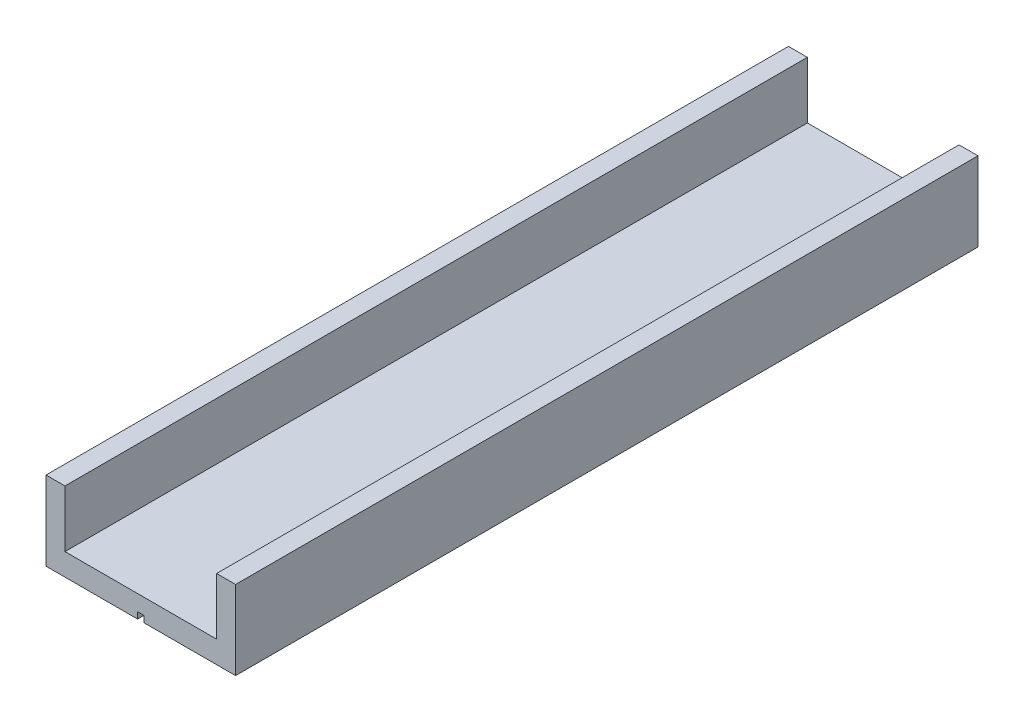
ISO-10303-21;
HEADER;
FILE_DESCRIPTION(('STEP AP214'),'2;1');
FILE_NAME('part.step','',(''),(''),'','','');
FILE_SCHEMA(('AUTOMOTIVE_DESIGN { 1 0 10303 214 1 1 1 1 }'));
ENDSEC;
DATA;
#1=APPLICATION_CONTEXT('core data for automotive mechanical design processes');
#2=APPLICATION_PROTOCOL_DEFINITION('international standard','automotive_design',2000,#1);
#3=PRODUCT_CONTEXT('',#1,'mechanical');
#4=PRODUCT('Part','Part','',(#3));
#5=PRODUCT_RELATED_PRODUCT_CATEGORY('part','',(#4));
#6=PRODUCT_DEFINITION_FORMATION('','',#4);
#7=PRODUCT_DEFINITION_CONTEXT('part definition',#1,'design');
#8=PRODUCT_DEFINITION('design','',#6,#7);
#9=PRODUCT_DEFINITION_SHAPE('','',#8);
#10=(LENGTH_UNIT() NAMED_UNIT(*) SI_UNIT(.MILLI.,.METRE.));
#11=(NAMED_UNIT(*) PLANE_ANGLE_UNIT() SI_UNIT($,.RADIAN.));
#12=(NAMED_UNIT(*) SI_UNIT($,.STERADIAN.) SOLID_ANGLE_UNIT());
#13=UNCERTAINTY_MEASURE_WITH_UNIT(LENGTH_MEASURE(1.E-05),#10,'distance_accuracy_value','');
#14=(GEOMETRIC_REPRESENTATION_CONTEXT(3) GLOBAL_UNCERTAINTY_ASSIGNED_CONTEXT((#13)) GLOBAL_UNIT_ASSIGNED_CONTEXT((#10,
#11,#12)) REPRESENTATION_CONTEXT('',''));
#15=CARTESIAN_POINT('',(0.,0.,0.));
#16=DIRECTION('',(0.,0.,1.));
#17=DIRECTION('',(1.,0.,0.));
#18=AXIS2_PLACEMENT_3D('',#15,#16,#17);
#19=CARTESIAN_POINT('',(0.,0.,235.));
#20=DIRECTION('',(1.,0.,0.));
#21=DIRECTION('',(0.,0.,-1.));
#22=AXIS2_PLACEMENT_3D('',#19,#20,#21);
#23=PLANE('',#22);
#24=DIRECTION('',(0.,-1.,0.));
#25=VECTOR('',#24,1.);
#26=CARTESIAN_POINT('',(0.,0.,0.));
#27=LINE('',#26,#25);
#28=CARTESIAN_POINT('',(0.,25.,0.));
#29=VERTEX_POINT('',#28);
#30=CARTESIAN_POINT('',(0.,0.,0.));
#31=VERTEX_POINT('',#30);
#32=EDGE_CURVE('E155',#29,#31,#27,.T.);
#33=ORIENTED_EDGE('',*,*,#32,.T.);
#34=DIRECTION('',(0.,0.,-1.));
#35=VECTOR('',#34,1.);
#36=CARTESIAN_POINT('',(0.,0.,235.));
#37=LINE('',#36,#35);
#38=CARTESIAN_POINT('',(0.,0.,235.));
#39=VERTEX_POINT('',#38);
#40=EDGE_CURVE('E11',#39,#31,#37,.T.);
#41=ORIENTED_EDGE('',*,*,#40,.F.);
#42=DIRECTION('',(0.,-1.,0.));
#43=VECTOR('',#42,1.);
#44=CARTESIAN_POINT('',(0.,0.,235.));
#45=LINE('',#44,#43);
#46=CARTESIAN_POINT('',(0.,25.,235.));
#47=VERTEX_POINT('',#46);
#48=EDGE_CURVE('E177',#47,#39,#45,.T.);
#49=ORIENTED_EDGE('',*,*,#48,.F.);
#50=DIRECTION('',(0.,0.,-1.));
#51=VECTOR('',#50,1.);
#52=CARTESIAN_POINT('',(0.,25.,235.));
#53=LINE('',#52,#51);
#54=EDGE_CURVE('E151',#47,#29,#53,.T.);
#55=ORIENTED_EDGE('',*,*,#54,.T.);
#56=EDGE_LOOP('',(#33,#41,#49,#55));
#57=FACE_BOUND('',#56,.T.);
#58=ADVANCED_FACE('F35',(#57),#23,.F.);
#59=CARTESIAN_POINT('',(0.,0.,235.));
#60=DIRECTION('',(0.,1.,0.));
#61=DIRECTION('',(0.,0.,1.));
#62=AXIS2_PLACEMENT_3D('',#59,#60,#61);
#63=PLANE('',#62);
#64=DIRECTION('',(1.,0.,0.));
#65=VECTOR('',#64,1.);
#66=CARTESIAN_POINT('',(0.,0.,0.));
#67=LINE('',#66,#65);
#68=CARTESIAN_POINT('',(29.,0.,0.));
#69=VERTEX_POINT('',#68);
#70=EDGE_CURVE('E158',#31,#69,#67,.T.);
#71=ORIENTED_EDGE('',*,*,#70,.T.);
#72=DIRECTION('',(0.,0.,-1.));
#73=VECTOR('',#72,1.);
#74=CARTESIAN_POINT('',(29.,0.,235.));
#75=LINE('',#74,#73);
#76=CARTESIAN_POINT('',(29.,0.,235.));
#77=VERTEX_POINT('',#76);
#78=EDGE_CURVE('E43',#77,#69,#75,.T.);
#79=ORIENTED_EDGE('',*,*,#78,.F.);
#80=DIRECTION('',(1.,0.,0.));
#81=VECTOR('',#80,1.);
#82=CARTESIAN_POINT('',(0.,0.,235.));
#83=LINE('',#82,#81);
#84=EDGE_CURVE('E106',#39,#77,#83,.T.);
#85=ORIENTED_EDGE('',*,*,#84,.F.);
#86=ORIENTED_EDGE('',*,*,#40,.T.);
#87=EDGE_LOOP('',(#71,#79,#85,#86));
#88=FACE_BOUND('',#87,.T.);
#89=ADVANCED_FACE('F255',(#88),#63,.F.);
#90=CARTESIAN_POINT('',(29.,0.,235.));
#91=DIRECTION('',(-1.,0.,0.));
#92=DIRECTION('',(0.,0.,1.));
#93=AXIS2_PLACEMENT_3D('',#90,#91,#92);
#94=PLANE('',#93);
#95=DIRECTION('',(0.,1.,0.));
#96=VECTOR('',#95,1.);
#97=CARTESIAN_POINT('',(29.,0.,0.));
#98=LINE('',#97,#96);
#99=CARTESIAN_POINT('',(29.,2.,0.));
#100=VERTEX_POINT('',#99);
#101=EDGE_CURVE('E160',#69,#100,#98,.T.);
#102=ORIENTED_EDGE('',*,*,#101,.T.);
#103=DIRECTION('',(0.,0.,-1.));
#104=VECTOR('',#103,1.);
#105=CARTESIAN_POINT('',(29.,2.,235.));
#106=LINE('',#105,#104);
#107=CARTESIAN_POINT('',(29.,2.,235.));
#108=VERTEX_POINT('',#107);
#109=EDGE_CURVE('E196',#108,#100,#106,.T.);
#110=ORIENTED_EDGE('',*,*,#109,.F.);
#111=DIRECTION('',(0.,1.,0.));
#112=VECTOR('',#111,1.);
#113=CARTESIAN_POINT('',(29.,0.,235.));
#114=LINE('',#113,#112);
#115=EDGE_CURVE('E204',#77,#108,#114,.T.);
#116=ORIENTED_EDGE('',*,*,#115,.F.);
#117=ORIENTED_EDGE('',*,*,#78,.T.);
#118=EDGE_LOOP('',(#102,#110,#116,#117));
#119=FACE_BOUND('',#118,.T.);
#120=ADVANCED_FACE('F202',(#119),#94,.F.);
#121=CARTESIAN_POINT('',(29.,2.,235.));
#122=DIRECTION('',(0.,1.,0.));
#123=DIRECTION('',(0.,0.,1.));
#124=AXIS2_PLACEMENT_3D('',#121,#122,#123);
#125=PLANE('',#124);
#126=DIRECTION('',(1.,0.,0.));
#127=VECTOR('',#126,1.);
#128=CARTESIAN_POINT('',(29.,2.,0.));
#129=LINE('',#128,#127);
#130=CARTESIAN_POINT('',(31.,2.,0.));
#131=VERTEX_POINT('',#130);
#132=EDGE_CURVE('E162',#100,#131,#129,.T.);
#133=ORIENTED_EDGE('',*,*,#132,.T.);
#134=DIRECTION('',(0.,0.,-1.));
#135=VECTOR('',#134,1.);
#136=CARTESIAN_POINT('',(31.,2.,235.));
#137=LINE('',#136,#135);
#138=CARTESIAN_POINT('',(31.,2.,235.));
#139=VERTEX_POINT('',#138);
#140=EDGE_CURVE('E193',#139,#131,#137,.T.);
#141=ORIENTED_EDGE('',*,*,#140,.F.);
#142=DIRECTION('',(1.,0.,0.));
#143=VECTOR('',#142,1.);
#144=CARTESIAN_POINT('',(29.,2.,235.));
#145=LINE('',#144,#143);
#146=EDGE_CURVE('E222',#108,#139,#145,.T.);
#147=ORIENTED_EDGE('',*,*,#146,.F.);
#148=ORIENTED_EDGE('',*,*,#109,.T.);
#149=EDGE_LOOP('',(#133,#141,#147,#148));
#150=FACE_BOUND('',#149,.T.);
#151=ADVANCED_FACE('F213',(#150),#125,.F.);
#152=CARTESIAN_POINT('',(31.,2.,235.));
#153=DIRECTION('',(1.,0.,0.));
#154=DIRECTION('',(0.,0.,-1.));
#155=AXIS2_PLACEMENT_3D('',#152,#153,#154);
#156=PLANE('',#155);
#157=DIRECTION('',(0.,-1.,0.));
#158=VECTOR('',#157,1.);
#159=CARTESIAN_POINT('',(31.,2.,0.));
#160=LINE('',#159,#158);
#161=CARTESIAN_POINT('',(31.,0.,0.));
#162=VERTEX_POINT('',#161);
#163=EDGE_CURVE('E164',#131,#162,#160,.T.);
#164=ORIENTED_EDGE('',*,*,#163,.T.);
#165=DIRECTION('',(0.,0.,-1.));
#166=VECTOR('',#165,1.);
#167=CARTESIAN_POINT('',(31.,0.,235.));
#168=LINE('',#167,#166);
#169=CARTESIAN_POINT('',(31.,0.,235.));
#170=VERTEX_POINT('',#169);
#171=EDGE_CURVE('E190',#170,#162,#168,.T.);
#172=ORIENTED_EDGE('',*,*,#171,.F.);
#173=DIRECTION('',(0.,-1.,0.));
#174=VECTOR('',#173,1.);
#175=CARTESIAN_POINT('',(31.,2.,235.));
#176=LINE('',#175,#174);
#177=EDGE_CURVE('E219',#139,#170,#176,.T.);
#178=ORIENTED_EDGE('',*,*,#177,.F.);
#179=ORIENTED_EDGE('',*,*,#140,.T.);
#180=EDGE_LOOP('',(#164,#172,#178,#179));
#181=FACE_BOUND('',#180,.T.);
#182=ADVANCED_FACE('F217',(#181),#156,.F.);
#183=CARTESIAN_POINT('',(60.,0.,235.));
#184=DIRECTION('',(0.,1.,0.));
#185=DIRECTION('',(-1.,0.,0.));
#186=AXIS2_PLACEMENT_3D('',#183,#184,#185);
#187=PLANE('',#186);
#188=DIRECTION('',(1.,0.,0.));
#189=VECTOR('',#188,1.);
#190=CARTESIAN_POINT('',(60.,0.,0.));
#191=LINE('',#190,#189);
#192=CARTESIAN_POINT('',(60.,0.,0.));
#193=VERTEX_POINT('',#192);
#194=EDGE_CURVE('E166',#162,#193,#191,.T.);
#195=ORIENTED_EDGE('',*,*,#194,.T.);
#196=DIRECTION('',(0.,0.,-1.));
#197=VECTOR('',#196,1.);
#198=CARTESIAN_POINT('',(60.,0.,235.));
#199=LINE('',#198,#197);
#200=CARTESIAN_POINT('',(60.,0.,235.));
#201=VERTEX_POINT('',#200);
#202=EDGE_CURVE('E187',#201,#193,#199,.T.);
#203=ORIENTED_EDGE('',*,*,#202,.F.);
#204=DIRECTION('',(1.,0.,0.));
#205=VECTOR('',#204,1.);
#206=CARTESIAN_POINT('',(60.,0.,235.));
#207=LINE('',#206,#205);
#208=EDGE_CURVE('E221',#170,#201,#207,.T.);
#209=ORIENTED_EDGE('',*,*,#208,.F.);
#210=ORIENTED_EDGE('',*,*,#171,.T.);
#211=EDGE_LOOP('',(#195,#203,#209,#210));
#212=FACE_BOUND('',#211,.T.);
#213=ADVANCED_FACE('F268',(#212),#187,.F.);
#214=CARTESIAN_POINT('',(60.,0.,235.));
#215=DIRECTION('',(-1.,0.,0.));
#216=DIRECTION('',(0.,0.,1.));
#217=AXIS2_PLACEMENT_3D('',#214,#215,#216);
#218=PLANE('',#217);
#219=DIRECTION('',(0.,1.,0.));
#220=VECTOR('',#219,1.);
#221=CARTESIAN_POINT('',(60.,0.,0.));
#222=LINE('',#221,#220);
#223=CARTESIAN_POINT('',(60.,25.,0.));
#224=VERTEX_POINT('',#223);
#225=EDGE_CURVE('E168',#193,#224,#222,.T.);
#226=ORIENTED_EDGE('',*,*,#225,.T.);
#227=DIRECTION('',(0.,0.,-1.));
#228=VECTOR('',#227,1.);
#229=CARTESIAN_POINT('',(60.,25.,235.));
#230=LINE('',#229,#228);
#231=CARTESIAN_POINT('',(60.,25.,235.));
#232=VERTEX_POINT('',#231);
#233=EDGE_CURVE('E184',#232,#224,#230,.T.);
#234=ORIENTED_EDGE('',*,*,#233,.F.);
#235=DIRECTION('',(0.,1.,0.));
#236=VECTOR('',#235,1.);
#237=CARTESIAN_POINT('',(60.,0.,235.));
#238=LINE('',#237,#236);
#239=EDGE_CURVE('E224',#201,#232,#238,.T.);
#240=ORIENTED_EDGE('',*,*,#239,.F.);
#241=ORIENTED_EDGE('',*,*,#202,.T.);
#242=EDGE_LOOP('',(#226,#234,#240,#241));
#243=FACE_BOUND('',#242,.T.);
#244=ADVANCED_FACE('F271',(#243),#218,.F.);
#245=CARTESIAN_POINT('',(60.,25.,235.));
#246=DIRECTION('',(0.,-1.,0.));
#247=DIRECTION('',(0.,0.,-1.));
#248=AXIS2_PLACEMENT_3D('',#245,#246,#247);
#249=PLANE('',#248);
#250=DIRECTION('',(-1.,0.,0.));
#251=VECTOR('',#250,1.);
#252=CARTESIAN_POINT('',(60.,25.,0.));
#253=LINE('',#252,#251);
#254=CARTESIAN_POINT('',(54.,25.,0.));
#255=VERTEX_POINT('',#254);
#256=EDGE_CURVE('E170',#224,#255,#253,.T.);
#257=ORIENTED_EDGE('',*,*,#256,.T.);
#258=DIRECTION('',(0.,0.,-1.));
#259=VECTOR('',#258,1.);
#260=CARTESIAN_POINT('',(54.,25.,235.));
#261=LINE('',#260,#259);
#262=CARTESIAN_POINT('',(54.,25.,235.));
#263=VERTEX_POINT('',#262);
#264=EDGE_CURVE('E181',#263,#255,#261,.T.);
#265=ORIENTED_EDGE('',*,*,#264,.F.);
#266=DIRECTION('',(-1.,0.,0.));
#267=VECTOR('',#266,1.);
#268=CARTESIAN_POINT('',(60.,25.,235.));
#269=LINE('',#268,#267);
#270=EDGE_CURVE('E230',#232,#263,#269,.T.);
#271=ORIENTED_EDGE('',*,*,#270,.F.);
#272=ORIENTED_EDGE('',*,*,#233,.T.);
#273=EDGE_LOOP('',(#257,#265,#271,#272));
#274=FACE_BOUND('',#273,.T.);
#275=ADVANCED_FACE('F236',(#274),#249,.F.);
#276=CARTESIAN_POINT('',(54.,25.,235.));
#277=DIRECTION('',(1.,0.,0.));
#278=DIRECTION('',(0.,0.,-1.));
#279=AXIS2_PLACEMENT_3D('',#276,#277,#278);
#280=PLANE('',#279);
#281=DIRECTION('',(0.,-1.,0.));
#282=VECTOR('',#281,1.);
#283=CARTESIAN_POINT('',(54.,25.,0.));
#284=LINE('',#283,#282);
#285=CARTESIAN_POINT('',(54.,7.,0.));
#286=VERTEX_POINT('',#285);
#287=EDGE_CURVE('E172',#255,#286,#284,.T.);
#288=ORIENTED_EDGE('',*,*,#287,.T.);
#289=DIRECTION('',(0.,0.,-1.));
#290=VECTOR('',#289,1.);
#291=CARTESIAN_POINT('',(54.,7.,235.));
#292=LINE('',#291,#290);
#293=CARTESIAN_POINT('',(54.,7.,235.));
#294=VERTEX_POINT('',#293);
#295=EDGE_CURVE('E146',#294,#286,#292,.T.);
#296=ORIENTED_EDGE('',*,*,#295,.F.);
#297=DIRECTION('',(0.,-1.,0.));
#298=VECTOR('',#297,1.);
#299=CARTESIAN_POINT('',(54.,25.,235.));
#300=LINE('',#299,#298);
#301=EDGE_CURVE('E137',#263,#294,#300,.T.);
#302=ORIENTED_EDGE('',*,*,#301,.F.);
#303=ORIENTED_EDGE('',*,*,#264,.T.);
#304=EDGE_LOOP('',(#288,#296,#302,#303));
#305=FACE_BOUND('',#304,.T.);
#306=ADVANCED_FACE('F240',(#305),#280,.F.);
#307=CARTESIAN_POINT('',(54.,7.,235.));
#308=DIRECTION('',(0.,-1.,0.));
#309=DIRECTION('',(0.,0.,-1.));
#310=AXIS2_PLACEMENT_3D('',#307,#308,#309);
#311=PLANE('',#310);
#312=DIRECTION('',(-1.,0.,0.));
#313=VECTOR('',#312,1.);
#314=CARTESIAN_POINT('',(54.,7.,0.));
#315=LINE('',#314,#313);
#316=CARTESIAN_POINT('',(6.,7.,0.));
#317=VERTEX_POINT('',#316);
#318=EDGE_CURVE('E145',#286,#317,#315,.T.);
#319=ORIENTED_EDGE('',*,*,#318,.T.);
#320=DIRECTION('',(0.,0.,-1.));
#321=VECTOR('',#320,1.);
#322=CARTESIAN_POINT('',(6.,7.,235.));
#323=LINE('',#322,#321);
#324=CARTESIAN_POINT('',(6.,7.,235.));
#325=VERTEX_POINT('',#324);
#326=EDGE_CURVE('E142',#325,#317,#323,.T.);
#327=ORIENTED_EDGE('',*,*,#326,.F.);
#328=DIRECTION('',(-1.,0.,0.));
#329=VECTOR('',#328,1.);
#330=CARTESIAN_POINT('',(54.,7.,235.));
#331=LINE('',#330,#329);
#332=EDGE_CURVE('E131',#294,#325,#331,.T.);
#333=ORIENTED_EDGE('',*,*,#332,.F.);
#334=ORIENTED_EDGE('',*,*,#295,.T.);
#335=EDGE_LOOP('',(#319,#327,#333,#334));
#336=FACE_BOUND('',#335,.T.);
#337=ADVANCED_FACE('F143',(#336),#311,.F.);
#338=CARTESIAN_POINT('',(6.,25.,235.));
#339=DIRECTION('',(-1.,0.,0.));
#340=DIRECTION('',(0.,-1.,0.));
#341=AXIS2_PLACEMENT_3D('',#338,#339,#340);
#342=PLANE('',#341);
#343=DIRECTION('',(0.,1.,0.));
#344=VECTOR('',#343,1.);
#345=CARTESIAN_POINT('',(6.,25.,0.));
#346=LINE('',#345,#344);
#347=CARTESIAN_POINT('',(6.,25.,0.));
#348=VERTEX_POINT('',#347);
#349=EDGE_CURVE('E92',#317,#348,#346,.T.);
#350=ORIENTED_EDGE('',*,*,#349,.T.);
#351=DIRECTION('',(0.,0.,-1.));
#352=VECTOR('',#351,1.);
#353=CARTESIAN_POINT('',(6.,25.,235.));
#354=LINE('',#353,#352);
#355=CARTESIAN_POINT('',(6.,25.,235.));
#356=VERTEX_POINT('',#355);
#357=EDGE_CURVE('E147',#356,#348,#354,.T.);
#358=ORIENTED_EDGE('',*,*,#357,.F.);
#359=DIRECTION('',(0.,1.,0.));
#360=VECTOR('',#359,1.);
#361=CARTESIAN_POINT('',(6.,25.,235.));
#362=LINE('',#361,#360);
#363=EDGE_CURVE('E135',#325,#356,#362,.T.);
#364=ORIENTED_EDGE('',*,*,#363,.F.);
#365=ORIENTED_EDGE('',*,*,#326,.T.);
#366=EDGE_LOOP('',(#350,#358,#364,#365));
#367=FACE_BOUND('',#366,.T.);
#368=ADVANCED_FACE('F149',(#367),#342,.F.);
#369=CARTESIAN_POINT('',(0.,25.,235.));
#370=DIRECTION('',(0.,-1.,0.));
#371=DIRECTION('',(0.,0.,-1.));
#372=AXIS2_PLACEMENT_3D('',#369,#370,#371);
#373=PLANE('',#372);
#374=DIRECTION('',(-1.,0.,0.));
#375=VECTOR('',#374,1.);
#376=CARTESIAN_POINT('',(0.,25.,0.));
#377=LINE('',#376,#375);
#378=EDGE_CURVE('E98',#348,#29,#377,.T.);
#379=ORIENTED_EDGE('',*,*,#378,.T.);
#380=ORIENTED_EDGE('',*,*,#54,.F.);
#381=DIRECTION('',(-1.,0.,0.));
#382=VECTOR('',#381,1.);
#383=CARTESIAN_POINT('',(0.,25.,235.));
#384=LINE('',#383,#382);
#385=EDGE_CURVE('E51',#356,#47,#384,.T.);
#386=ORIENTED_EDGE('',*,*,#385,.F.);
#387=ORIENTED_EDGE('',*,*,#357,.T.);
#388=EDGE_LOOP('',(#379,#380,#386,#387));
#389=FACE_BOUND('',#388,.T.);
#390=ADVANCED_FACE('F244',(#389),#373,.F.);
#391=CARTESIAN_POINT('',(0.,0.,235.));
#392=DIRECTION('',(0.,0.,-1.));
#393=DIRECTION('',(-1.,0.,0.));
#394=AXIS2_PLACEMENT_3D('',#391,#392,#393);
#395=PLANE('',#394);
#396=ORIENTED_EDGE('',*,*,#48,.T.);
#397=ORIENTED_EDGE('',*,*,#84,.T.);
#398=ORIENTED_EDGE('',*,*,#115,.T.);
#399=ORIENTED_EDGE('',*,*,#146,.T.);
#400=ORIENTED_EDGE('',*,*,#177,.T.);
#401=ORIENTED_EDGE('',*,*,#208,.T.);
#402=ORIENTED_EDGE('',*,*,#239,.T.);
#403=ORIENTED_EDGE('',*,*,#270,.T.);
#404=ORIENTED_EDGE('',*,*,#301,.T.);
#405=ORIENTED_EDGE('',*,*,#332,.T.);
#406=ORIENTED_EDGE('',*,*,#363,.T.);
#407=ORIENTED_EDGE('',*,*,#385,.T.);
#408=EDGE_LOOP('',(#396,#397,#398,#399,#400,#401,#402,#403,#404,#405,#406,#407));
#409=FACE_BOUND('',#408,.T.);
#410=ADVANCED_FACE('F133',(#409),#395,.F.);
#411=CARTESIAN_POINT('',(0.,0.,0.));
#412=DIRECTION('',(0.,0.,-1.));
#413=DIRECTION('',(-1.,0.,0.));
#414=AXIS2_PLACEMENT_3D('',#411,#412,#413);
#415=PLANE('',#414);
#416=ORIENTED_EDGE('',*,*,#32,.F.);
#417=ORIENTED_EDGE('',*,*,#378,.F.);
#418=ORIENTED_EDGE('',*,*,#349,.F.);
#419=ORIENTED_EDGE('',*,*,#318,.F.);
#420=ORIENTED_EDGE('',*,*,#287,.F.);
#421=ORIENTED_EDGE('',*,*,#256,.F.);
#422=ORIENTED_EDGE('',*,*,#225,.F.);
#423=ORIENTED_EDGE('',*,*,#194,.F.);
#424=ORIENTED_EDGE('',*,*,#163,.F.);
#425=ORIENTED_EDGE('',*,*,#132,.F.);
#426=ORIENTED_EDGE('',*,*,#101,.F.);
#427=ORIENTED_EDGE('',*,*,#70,.F.);
#428=EDGE_LOOP('',(#416,#417,#418,#419,#420,#421,#422,#423,#424,#425,#426,#427));
#429=FACE_BOUND('',#428,.T.);
#430=ADVANCED_FACE('F208',(#429),#415,.T.);
#431=CLOSED_SHELL('',(#58,#89,#120,#151,#182,#213,#244,#275,#306,#337,#368,#390,#410,#430));
#432=MANIFOLD_SOLID_BREP('B2',#431);
#433=ADVANCED_BREP_SHAPE_REPRESENTATION('',(#18,#432),#14);
#434=SHAPE_DEFINITION_REPRESENTATION(#9,#433);
ENDSEC;
END-ISO-10303-21;
